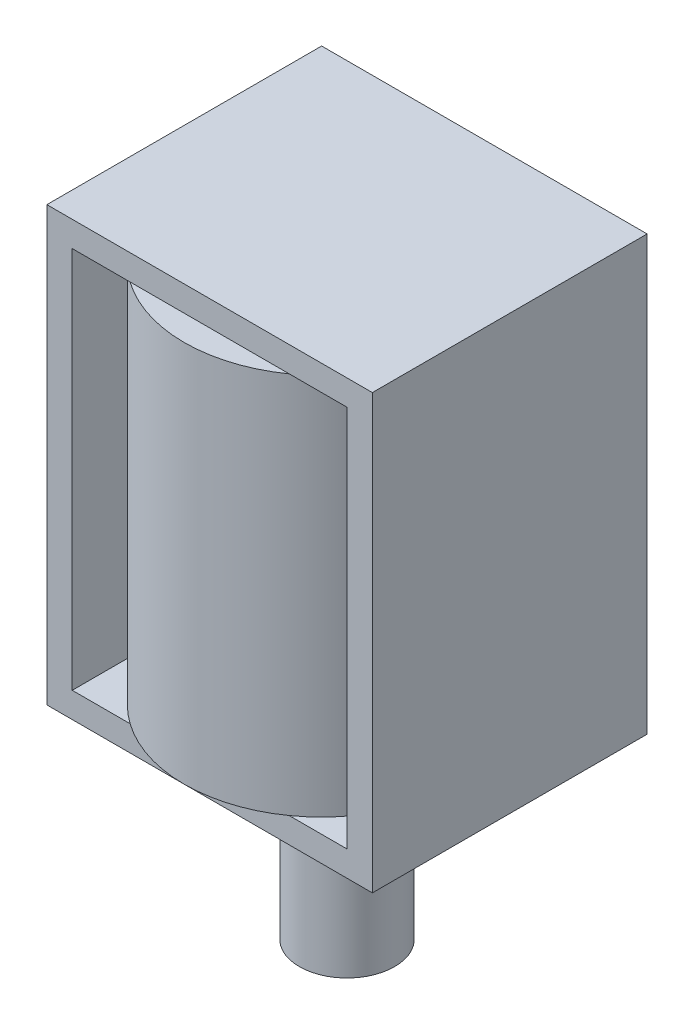
ISO-10303-21;
HEADER;
FILE_DESCRIPTION(('STEP AP214'),'2;1');
FILE_NAME('part.step','',(''),(''),'','','');
FILE_SCHEMA(('AUTOMOTIVE_DESIGN { 1 0 10303 214 1 1 1 1 }'));
ENDSEC;
DATA;
#1=APPLICATION_CONTEXT('core data for automotive mechanical design processes');
#2=APPLICATION_PROTOCOL_DEFINITION('international standard','automotive_design',2000,#1);
#3=PRODUCT_CONTEXT('',#1,'mechanical');
#4=PRODUCT('Part','Part','',(#3));
#5=PRODUCT_RELATED_PRODUCT_CATEGORY('part','',(#4));
#6=PRODUCT_DEFINITION_FORMATION('','',#4);
#7=PRODUCT_DEFINITION_CONTEXT('part definition',#1,'design');
#8=PRODUCT_DEFINITION('design','',#6,#7);
#9=PRODUCT_DEFINITION_SHAPE('','',#8);
#10=(LENGTH_UNIT() NAMED_UNIT(*) SI_UNIT(.MILLI.,.METRE.));
#11=(NAMED_UNIT(*) PLANE_ANGLE_UNIT() SI_UNIT($,.RADIAN.));
#12=(NAMED_UNIT(*) SI_UNIT($,.STERADIAN.) SOLID_ANGLE_UNIT());
#13=UNCERTAINTY_MEASURE_WITH_UNIT(LENGTH_MEASURE(1.E-05),#10,'distance_accuracy_value','');
#14=(GEOMETRIC_REPRESENTATION_CONTEXT(3) GLOBAL_UNCERTAINTY_ASSIGNED_CONTEXT((#13)) GLOBAL_UNIT_ASSIGNED_CONTEXT((#10,
#11,#12)) REPRESENTATION_CONTEXT('',''));
#15=CARTESIAN_POINT('',(0.,0.,0.));
#16=DIRECTION('',(0.,0.,1.));
#17=DIRECTION('',(1.,0.,0.));
#18=AXIS2_PLACEMENT_3D('',#15,#16,#17);
#19=CARTESIAN_POINT('',(-6.5,1.2,6.5));
#20=DIRECTION('',(1.,0.,0.));
#21=DIRECTION('',(0.,0.,-1.));
#22=AXIS2_PLACEMENT_3D('',#19,#20,#21);
#23=PLANE('',#22);
#24=DIRECTION('',(0.,0.,-1.));
#25=VECTOR('',#24,1.);
#26=CARTESIAN_POINT('',(-6.5,1.2,6.5));
#27=LINE('',#26,#25);
#28=CARTESIAN_POINT('',(-6.5,1.2,6.5));
#29=VERTEX_POINT('',#28);
#30=CARTESIAN_POINT('',(-6.5,1.2,1.2));
#31=VERTEX_POINT('',#30);
#32=EDGE_CURVE('E163',#29,#31,#27,.T.);
#33=ORIENTED_EDGE('',*,*,#32,.T.);
#34=DIRECTION('',(0.,-1.,0.));
#35=VECTOR('',#34,1.);
#36=CARTESIAN_POINT('',(-6.5,38.5520128817742,1.2));
#37=LINE('',#36,#35);
#38=CARTESIAN_POINT('',(-6.5,19.3,1.2));
#39=VERTEX_POINT('',#38);
#40=EDGE_CURVE('E157',#39,#31,#37,.T.);
#41=ORIENTED_EDGE('',*,*,#40,.F.);
#42=DIRECTION('',(0.,0.,-1.));
#43=VECTOR('',#42,1.);
#44=CARTESIAN_POINT('',(-6.5,19.3,6.5));
#45=LINE('',#44,#43);
#46=CARTESIAN_POINT('',(-6.5,19.3,6.5));
#47=VERTEX_POINT('',#46);
#48=EDGE_CURVE('E229',#47,#39,#45,.T.);
#49=ORIENTED_EDGE('',*,*,#48,.F.);
#50=DIRECTION('',(0.,-1.,0.));
#51=VECTOR('',#50,1.);
#52=CARTESIAN_POINT('',(-6.5,1.2,6.5));
#53=LINE('',#52,#51);
#54=EDGE_CURVE('E223',#47,#29,#53,.T.);
#55=ORIENTED_EDGE('',*,*,#54,.T.);
#56=EDGE_LOOP('',(#33,#41,#49,#55));
#57=FACE_BOUND('',#56,.T.);
#58=ADVANCED_FACE('F33',(#57),#23,.T.);
#59=CARTESIAN_POINT('',(-6.5,1.2,6.5));
#60=DIRECTION('',(0.,1.,0.));
#61=DIRECTION('',(0.,0.,1.));
#62=AXIS2_PLACEMENT_3D('',#59,#60,#61);
#63=PLANE('',#62);
#64=DIRECTION('',(1.,0.,0.));
#65=VECTOR('',#64,1.);
#66=CARTESIAN_POINT('',(-6.5,1.2,6.5));
#67=LINE('',#66,#65);
#68=CARTESIAN_POINT('',(-3.76297754444536,1.2,6.5));
#69=VERTEX_POINT('',#68);
#70=EDGE_CURVE('E255',#29,#69,#67,.T.);
#71=ORIENTED_EDGE('',*,*,#70,.T.);
#72=CARTESIAN_POINT('',(0.,1.2,1.2));
#73=DIRECTION('',(0.,1.,0.));
#74=DIRECTION('',(0.,0.,1.));
#75=AXIS2_PLACEMENT_3D('',#72,#73,#74);
#76=CIRCLE('',#75,6.5);
#77=EDGE_CURVE('E240',#31,#69,#76,.T.);
#78=ORIENTED_EDGE('',*,*,#77,.F.);
#79=ORIENTED_EDGE('',*,*,#32,.F.);
#80=EDGE_LOOP('',(#71,#78,#79));
#81=FACE_BOUND('',#80,.T.);
#82=ADVANCED_FACE('F297',(#81),#63,.T.);
#83=DIRECTION('',(0.,0.,-1.));
#84=VECTOR('',#83,1.);
#85=CARTESIAN_POINT('',(6.5,1.2,6.5));
#86=LINE('',#85,#84);
#87=CARTESIAN_POINT('',(6.5,1.2,6.5));
#88=VERTEX_POINT('',#87);
#89=CARTESIAN_POINT('',(6.5,1.2,1.2));
#90=VERTEX_POINT('',#89);
#91=EDGE_CURVE('E164',#88,#90,#86,.T.);
#92=ORIENTED_EDGE('',*,*,#91,.T.);
#93=CARTESIAN_POINT('',(3.76297754444536,1.2,6.5));
#94=VERTEX_POINT('',#93);
#95=EDGE_CURVE('E246',#94,#90,#76,.T.);
#96=ORIENTED_EDGE('',*,*,#95,.F.);
#97=EDGE_CURVE('E224',#94,#88,#67,.T.);
#98=ORIENTED_EDGE('',*,*,#97,.T.);
#99=EDGE_LOOP('',(#92,#96,#98));
#100=FACE_BOUND('',#99,.T.);
#101=ADVANCED_FACE('F303',(#100),#63,.T.);
#102=CARTESIAN_POINT('',(-6.5,1.2,0.));
#103=VERTEX_POINT('',#102);
#104=CARTESIAN_POINT('',(-6.5,1.2,-6.5));
#105=VERTEX_POINT('',#104);
#106=EDGE_CURVE('E154',#103,#105,#27,.T.);
#107=ORIENTED_EDGE('',*,*,#106,.F.);
#108=CARTESIAN_POINT('',(0.,1.2,0.));
#109=DIRECTION('',(0.,1.,0.));
#110=DIRECTION('',(0.,0.,1.));
#111=AXIS2_PLACEMENT_3D('',#108,#109,#110);
#112=CIRCLE('',#111,6.5);
#113=CARTESIAN_POINT('',(0.,1.2,-6.5));
#114=VERTEX_POINT('',#113);
#115=EDGE_CURVE('E139',#114,#103,#112,.T.);
#116=ORIENTED_EDGE('',*,*,#115,.F.);
#117=DIRECTION('',(1.,0.,0.));
#118=VECTOR('',#117,1.);
#119=CARTESIAN_POINT('',(-6.5,1.2,-6.5));
#120=LINE('',#119,#118);
#121=EDGE_CURVE('E161',#105,#114,#120,.T.);
#122=ORIENTED_EDGE('',*,*,#121,.F.);
#123=EDGE_LOOP('',(#107,#116,#122));
#124=FACE_BOUND('',#123,.T.);
#125=ADVANCED_FACE('F159',(#124),#63,.T.);
#126=CARTESIAN_POINT('',(6.5,1.2,6.5));
#127=DIRECTION('',(-1.,0.,0.));
#128=DIRECTION('',(0.,-1.,0.));
#129=AXIS2_PLACEMENT_3D('',#126,#127,#128);
#130=PLANE('',#129);
#131=CARTESIAN_POINT('',(6.5,1.2,0.));
#132=VERTEX_POINT('',#131);
#133=CARTESIAN_POINT('',(6.5,1.2,-6.5));
#134=VERTEX_POINT('',#133);
#135=EDGE_CURVE('E169',#132,#134,#86,.T.);
#136=ORIENTED_EDGE('',*,*,#135,.F.);
#137=DIRECTION('',(0.,-1.,0.));
#138=VECTOR('',#137,1.);
#139=CARTESIAN_POINT('',(6.5,38.5520128817742,0.));
#140=LINE('',#139,#138);
#141=CARTESIAN_POINT('',(6.5,19.3,0.));
#142=VERTEX_POINT('',#141);
#143=EDGE_CURVE('E239',#142,#132,#140,.T.);
#144=ORIENTED_EDGE('',*,*,#143,.F.);
#145=DIRECTION('',(0.,0.,-1.));
#146=VECTOR('',#145,1.);
#147=CARTESIAN_POINT('',(6.5,19.3,6.5));
#148=LINE('',#147,#146);
#149=CARTESIAN_POINT('',(6.5,19.3,-6.5));
#150=VERTEX_POINT('',#149);
#151=EDGE_CURVE('E212',#142,#150,#148,.T.);
#152=ORIENTED_EDGE('',*,*,#151,.T.);
#153=DIRECTION('',(0.,1.,0.));
#154=VECTOR('',#153,1.);
#155=CARTESIAN_POINT('',(6.5,1.2,-6.5));
#156=LINE('',#155,#154);
#157=EDGE_CURVE('E219',#134,#150,#156,.T.);
#158=ORIENTED_EDGE('',*,*,#157,.F.);
#159=EDGE_LOOP('',(#136,#144,#152,#158));
#160=FACE_BOUND('',#159,.T.);
#161=ADVANCED_FACE('F238',(#160),#130,.T.);
#162=CARTESIAN_POINT('',(-6.5,19.3,6.5));
#163=DIRECTION('',(0.,-1.,0.));
#164=DIRECTION('',(0.,0.,-1.));
#165=AXIS2_PLACEMENT_3D('',#162,#163,#164);
#166=PLANE('',#165);
#167=ORIENTED_EDGE('',*,*,#48,.T.);
#168=CARTESIAN_POINT('',(0.,19.3,1.2));
#169=DIRECTION('',(0.,-1.,0.));
#170=DIRECTION('',(0.,0.,-1.));
#171=AXIS2_PLACEMENT_3D('',#168,#169,#170);
#172=CIRCLE('',#171,6.5);
#173=CARTESIAN_POINT('',(-3.76297754444536,19.3,6.5));
#174=VERTEX_POINT('',#173);
#175=EDGE_CURVE('E11',#39,#174,#172,.F.);
#176=ORIENTED_EDGE('',*,*,#175,.T.);
#177=DIRECTION('',(-1.,0.,0.));
#178=VECTOR('',#177,1.);
#179=CARTESIAN_POINT('',(-6.5,19.3,6.5));
#180=LINE('',#179,#178);
#181=EDGE_CURVE('E260',#174,#47,#180,.T.);
#182=ORIENTED_EDGE('',*,*,#181,.T.);
#183=EDGE_LOOP('',(#167,#176,#182));
#184=FACE_BOUND('',#183,.T.);
#185=ADVANCED_FACE('F278',(#184),#166,.T.);
#186=CARTESIAN_POINT('',(6.5,19.3,6.5));
#187=VERTEX_POINT('',#186);
#188=CARTESIAN_POINT('',(3.76297754444536,19.3,6.5));
#189=VERTEX_POINT('',#188);
#190=EDGE_CURVE('E261',#187,#189,#180,.T.);
#191=ORIENTED_EDGE('',*,*,#190,.T.);
#192=CARTESIAN_POINT('',(0.,19.3,1.2));
#193=DIRECTION('',(0.,-1.,0.));
#194=DIRECTION('',(0.,0.,-1.));
#195=AXIS2_PLACEMENT_3D('',#192,#193,#194);
#196=CIRCLE('',#195,6.5);
#197=CARTESIAN_POINT('',(6.5,19.3,1.2));
#198=VERTEX_POINT('',#197);
#199=EDGE_CURVE('E270',#198,#189,#196,.T.);
#200=ORIENTED_EDGE('',*,*,#199,.F.);
#201=EDGE_CURVE('E231',#187,#198,#148,.T.);
#202=ORIENTED_EDGE('',*,*,#201,.F.);
#203=EDGE_LOOP('',(#191,#200,#202));
#204=FACE_BOUND('',#203,.T.);
#205=ADVANCED_FACE('F349',(#204),#166,.T.);
#206=DIRECTION('',(-1.,0.,0.));
#207=VECTOR('',#206,1.);
#208=CARTESIAN_POINT('',(-6.5,19.3,-6.5));
#209=LINE('',#208,#207);
#210=CARTESIAN_POINT('',(0.,19.3,-6.5));
#211=VERTEX_POINT('',#210);
#212=CARTESIAN_POINT('',(-6.5,19.3,-6.5));
#213=VERTEX_POINT('',#212);
#214=EDGE_CURVE('E216',#211,#213,#209,.T.);
#215=ORIENTED_EDGE('',*,*,#214,.F.);
#216=CARTESIAN_POINT('',(0.,19.3,0.));
#217=DIRECTION('',(0.,-1.,0.));
#218=DIRECTION('',(0.,0.,-1.));
#219=AXIS2_PLACEMENT_3D('',#216,#217,#218);
#220=CIRCLE('',#219,6.5);
#221=CARTESIAN_POINT('',(-6.5,19.3,0.));
#222=VERTEX_POINT('',#221);
#223=EDGE_CURVE('E56',#222,#211,#220,.T.);
#224=ORIENTED_EDGE('',*,*,#223,.F.);
#225=EDGE_CURVE('E155',#222,#213,#45,.T.);
#226=ORIENTED_EDGE('',*,*,#225,.T.);
#227=EDGE_LOOP('',(#215,#224,#226));
#228=FACE_BOUND('',#227,.T.);
#229=ADVANCED_FACE('F217',(#228),#166,.T.);
#230=CARTESIAN_POINT('',(0.,0.,6.5));
#231=DIRECTION('',(0.,0.,-1.));
#232=DIRECTION('',(-1.,0.,0.));
#233=AXIS2_PLACEMENT_3D('',#230,#231,#232);
#234=PLANE('',#233);
#235=DIRECTION('',(0.,-1.,0.));
#236=VECTOR('',#235,1.);
#237=CARTESIAN_POINT('',(-7.7,0.,6.5));
#238=LINE('',#237,#236);
#239=CARTESIAN_POINT('',(-7.7,20.5,6.5));
#240=VERTEX_POINT('',#239);
#241=CARTESIAN_POINT('',(-7.7,0.,6.5));
#242=VERTEX_POINT('',#241);
#243=EDGE_CURVE('E173',#240,#242,#238,.T.);
#244=ORIENTED_EDGE('',*,*,#243,.T.);
#245=DIRECTION('',(1.,0.,0.));
#246=VECTOR('',#245,1.);
#247=CARTESIAN_POINT('',(-7.7,0.,6.5));
#248=LINE('',#247,#246);
#249=CARTESIAN_POINT('',(7.7,0.,6.5));
#250=VERTEX_POINT('',#249);
#251=EDGE_CURVE('E176',#242,#250,#248,.T.);
#252=ORIENTED_EDGE('',*,*,#251,.T.);
#253=DIRECTION('',(0.,1.,0.));
#254=VECTOR('',#253,1.);
#255=CARTESIAN_POINT('',(7.7,0.,6.5));
#256=LINE('',#255,#254);
#257=CARTESIAN_POINT('',(7.7,20.5,6.5));
#258=VERTEX_POINT('',#257);
#259=EDGE_CURVE('E179',#250,#258,#256,.T.);
#260=ORIENTED_EDGE('',*,*,#259,.T.);
#261=DIRECTION('',(-1.,0.,0.));
#262=VECTOR('',#261,1.);
#263=CARTESIAN_POINT('',(-7.7,20.5,6.5));
#264=LINE('',#263,#262);
#265=EDGE_CURVE('E181',#258,#240,#264,.T.);
#266=ORIENTED_EDGE('',*,*,#265,.T.);
#267=EDGE_LOOP('',(#244,#252,#260,#266));
#268=FACE_BOUND('',#267,.T.);
#269=ORIENTED_EDGE('',*,*,#54,.F.);
#270=ORIENTED_EDGE('',*,*,#181,.F.);
#271=EDGE_CURVE('E264',#189,#174,#180,.T.);
#272=ORIENTED_EDGE('',*,*,#271,.F.);
#273=ORIENTED_EDGE('',*,*,#190,.F.);
#274=DIRECTION('',(0.,1.,0.));
#275=VECTOR('',#274,1.);
#276=CARTESIAN_POINT('',(6.5,1.2,6.5));
#277=LINE('',#276,#275);
#278=EDGE_CURVE('E258',#88,#187,#277,.T.);
#279=ORIENTED_EDGE('',*,*,#278,.F.);
#280=ORIENTED_EDGE('',*,*,#97,.F.);
#281=DIRECTION('',(1.,0.,0.));
#282=VECTOR('',#281,1.);
#283=CARTESIAN_POINT('',(0.,1.2,6.5));
#284=LINE('',#283,#282);
#285=EDGE_CURVE('E249',#69,#94,#284,.T.);
#286=ORIENTED_EDGE('',*,*,#285,.F.);
#287=ORIENTED_EDGE('',*,*,#70,.F.);
#288=EDGE_LOOP('',(#269,#270,#272,#273,#279,#280,#286,#287));
#289=FACE_BOUND('',#288,.T.);
#290=ADVANCED_FACE('F282',(#268,#289),#234,.F.);
#291=CARTESIAN_POINT('',(0.,0.,-6.5));
#292=DIRECTION('',(0.,0.,-1.));
#293=DIRECTION('',(-1.,0.,0.));
#294=AXIS2_PLACEMENT_3D('',#291,#292,#293);
#295=PLANE('',#294);
#296=DIRECTION('',(0.,-1.,0.));
#297=VECTOR('',#296,1.);
#298=CARTESIAN_POINT('',(-7.7,0.,-6.5));
#299=LINE('',#298,#297);
#300=CARTESIAN_POINT('',(-7.7,20.5,-6.5));
#301=VERTEX_POINT('',#300);
#302=CARTESIAN_POINT('',(-7.7,0.,-6.5));
#303=VERTEX_POINT('',#302);
#304=EDGE_CURVE('E167',#301,#303,#299,.T.);
#305=ORIENTED_EDGE('',*,*,#304,.F.);
#306=DIRECTION('',(-1.,0.,0.));
#307=VECTOR('',#306,1.);
#308=CARTESIAN_POINT('',(-7.7,20.5,-6.5));
#309=LINE('',#308,#307);
#310=CARTESIAN_POINT('',(7.7,20.5,-6.5));
#311=VERTEX_POINT('',#310);
#312=EDGE_CURVE('E177',#311,#301,#309,.T.);
#313=ORIENTED_EDGE('',*,*,#312,.F.);
#314=DIRECTION('',(0.,1.,0.));
#315=VECTOR('',#314,1.);
#316=CARTESIAN_POINT('',(7.7,0.,-6.5));
#317=LINE('',#316,#315);
#318=CARTESIAN_POINT('',(7.7,0.,-6.5));
#319=VERTEX_POINT('',#318);
#320=EDGE_CURVE('E188',#319,#311,#317,.T.);
#321=ORIENTED_EDGE('',*,*,#320,.F.);
#322=DIRECTION('',(1.,0.,0.));
#323=VECTOR('',#322,1.);
#324=CARTESIAN_POINT('',(-7.7,0.,-6.5));
#325=LINE('',#324,#323);
#326=EDGE_CURVE('E186',#303,#319,#325,.T.);
#327=ORIENTED_EDGE('',*,*,#326,.F.);
#328=EDGE_LOOP('',(#305,#313,#321,#327));
#329=FACE_BOUND('',#328,.T.);
#330=EDGE_CURVE('E210',#150,#211,#209,.T.);
#331=ORIENTED_EDGE('',*,*,#330,.T.);
#332=ORIENTED_EDGE('',*,*,#214,.T.);
#333=DIRECTION('',(0.,-1.,0.));
#334=VECTOR('',#333,1.);
#335=CARTESIAN_POINT('',(-6.5,1.2,-6.5));
#336=LINE('',#335,#334);
#337=EDGE_CURVE('E253',#213,#105,#336,.T.);
#338=ORIENTED_EDGE('',*,*,#337,.T.);
#339=ORIENTED_EDGE('',*,*,#121,.T.);
#340=EDGE_CURVE('E265',#114,#134,#120,.T.);
#341=ORIENTED_EDGE('',*,*,#340,.T.);
#342=ORIENTED_EDGE('',*,*,#157,.T.);
#343=EDGE_LOOP('',(#331,#332,#338,#339,#341,#342));
#344=FACE_BOUND('',#343,.T.);
#345=ADVANCED_FACE('F221',(#329,#344),#295,.T.);
#346=CARTESIAN_POINT('',(-7.7,0.,6.5));
#347=DIRECTION('',(1.,0.,0.));
#348=DIRECTION('',(0.,0.,-1.));
#349=AXIS2_PLACEMENT_3D('',#346,#347,#348);
#350=PLANE('',#349);
#351=ORIENTED_EDGE('',*,*,#304,.T.);
#352=DIRECTION('',(0.,0.,-1.));
#353=VECTOR('',#352,1.);
#354=CARTESIAN_POINT('',(-7.7,0.,6.5));
#355=LINE('',#354,#353);
#356=EDGE_CURVE('E199',#242,#303,#355,.T.);
#357=ORIENTED_EDGE('',*,*,#356,.F.);
#358=ORIENTED_EDGE('',*,*,#243,.F.);
#359=DIRECTION('',(0.,0.,-1.));
#360=VECTOR('',#359,1.);
#361=CARTESIAN_POINT('',(-7.7,20.5,6.5));
#362=LINE('',#361,#360);
#363=EDGE_CURVE('E183',#240,#301,#362,.T.);
#364=ORIENTED_EDGE('',*,*,#363,.T.);
#365=EDGE_LOOP('',(#351,#357,#358,#364));
#366=FACE_BOUND('',#365,.T.);
#367=ADVANCED_FACE('F35',(#366),#350,.F.);
#368=CARTESIAN_POINT('',(-7.7,0.,6.5));
#369=DIRECTION('',(0.,1.,0.));
#370=DIRECTION('',(0.,0.,1.));
#371=AXIS2_PLACEMENT_3D('',#368,#369,#370);
#372=PLANE('',#371);
#373=CARTESIAN_POINT('',(0.,0.,0.));
#374=DIRECTION('',(0.,1.,0.));
#375=DIRECTION('',(0.,0.,1.));
#376=AXIS2_PLACEMENT_3D('',#373,#374,#375);
#377=CIRCLE('',#376,2.25);
#378=CARTESIAN_POINT('',(0.,0.,2.25));
#379=VERTEX_POINT('',#378);
#380=EDGE_CURVE('E202',#379,#379,#377,.F.);
#381=ORIENTED_EDGE('',*,*,#380,.F.);
#382=EDGE_LOOP('',(#381));
#383=FACE_BOUND('',#382,.T.);
#384=ORIENTED_EDGE('',*,*,#326,.T.);
#385=DIRECTION('',(0.,0.,-1.));
#386=VECTOR('',#385,1.);
#387=CARTESIAN_POINT('',(7.7,0.,6.5));
#388=LINE('',#387,#386);
#389=EDGE_CURVE('E196',#250,#319,#388,.T.);
#390=ORIENTED_EDGE('',*,*,#389,.F.);
#391=ORIENTED_EDGE('',*,*,#251,.F.);
#392=ORIENTED_EDGE('',*,*,#356,.T.);
#393=EDGE_LOOP('',(#384,#390,#391,#392));
#394=FACE_BOUND('',#393,.T.);
#395=ADVANCED_FACE('F320',(#383,#394),#372,.F.);
#396=CARTESIAN_POINT('',(7.7,0.,6.5));
#397=DIRECTION('',(-1.,0.,0.));
#398=DIRECTION('',(0.,0.,1.));
#399=AXIS2_PLACEMENT_3D('',#396,#397,#398);
#400=PLANE('',#399);
#401=ORIENTED_EDGE('',*,*,#320,.T.);
#402=DIRECTION('',(0.,0.,-1.));
#403=VECTOR('',#402,1.);
#404=CARTESIAN_POINT('',(7.7,20.5,6.5));
#405=LINE('',#404,#403);
#406=EDGE_CURVE('E193',#258,#311,#405,.T.);
#407=ORIENTED_EDGE('',*,*,#406,.F.);
#408=ORIENTED_EDGE('',*,*,#259,.F.);
#409=ORIENTED_EDGE('',*,*,#389,.T.);
#410=EDGE_LOOP('',(#401,#407,#408,#409));
#411=FACE_BOUND('',#410,.T.);
#412=ADVANCED_FACE('F314',(#411),#400,.F.);
#413=CARTESIAN_POINT('',(-7.7,20.5,6.5));
#414=DIRECTION('',(0.,-1.,0.));
#415=DIRECTION('',(0.,0.,-1.));
#416=AXIS2_PLACEMENT_3D('',#413,#414,#415);
#417=PLANE('',#416);
#418=ORIENTED_EDGE('',*,*,#312,.T.);
#419=ORIENTED_EDGE('',*,*,#363,.F.);
#420=ORIENTED_EDGE('',*,*,#265,.F.);
#421=ORIENTED_EDGE('',*,*,#406,.T.);
#422=EDGE_LOOP('',(#418,#419,#420,#421));
#423=FACE_BOUND('',#422,.T.);
#424=ADVANCED_FACE('F308',(#423),#417,.F.);
#425=DIRECTION('',(0.,-1.,0.));
#426=VECTOR('',#425,1.);
#427=CARTESIAN_POINT('',(-6.5,38.5520128817742,0.));
#428=LINE('',#427,#426);
#429=EDGE_CURVE('E142',#222,#103,#428,.T.);
#430=ORIENTED_EDGE('',*,*,#429,.T.);
#431=ORIENTED_EDGE('',*,*,#106,.T.);
#432=ORIENTED_EDGE('',*,*,#337,.F.);
#433=ORIENTED_EDGE('',*,*,#225,.F.);
#434=EDGE_LOOP('',(#430,#431,#432,#433));
#435=FACE_BOUND('',#434,.T.);
#436=ADVANCED_FACE('F152',(#435),#23,.T.);
#437=ORIENTED_EDGE('',*,*,#340,.F.);
#438=EDGE_CURVE('E144',#132,#114,#112,.T.);
#439=ORIENTED_EDGE('',*,*,#438,.F.);
#440=ORIENTED_EDGE('',*,*,#135,.T.);
#441=EDGE_LOOP('',(#437,#439,#440));
#442=FACE_BOUND('',#441,.T.);
#443=ADVANCED_FACE('F267',(#442),#63,.T.);
#444=DIRECTION('',(0.,-1.,0.));
#445=VECTOR('',#444,1.);
#446=CARTESIAN_POINT('',(6.5,38.5520128817742,1.2));
#447=LINE('',#446,#445);
#448=EDGE_CURVE('E48',#198,#90,#447,.T.);
#449=ORIENTED_EDGE('',*,*,#448,.T.);
#450=ORIENTED_EDGE('',*,*,#91,.F.);
#451=ORIENTED_EDGE('',*,*,#278,.T.);
#452=ORIENTED_EDGE('',*,*,#201,.T.);
#453=EDGE_LOOP('',(#449,#450,#451,#452));
#454=FACE_BOUND('',#453,.T.);
#455=ADVANCED_FACE('F313',(#454),#130,.T.);
#456=ORIENTED_EDGE('',*,*,#151,.F.);
#457=CARTESIAN_POINT('',(0.,19.3,0.));
#458=DIRECTION('',(0.,-1.,0.));
#459=DIRECTION('',(0.,0.,-1.));
#460=AXIS2_PLACEMENT_3D('',#457,#458,#459);
#461=CIRCLE('',#460,6.5);
#462=EDGE_CURVE('E41',#142,#211,#461,.F.);
#463=ORIENTED_EDGE('',*,*,#462,.T.);
#464=ORIENTED_EDGE('',*,*,#330,.F.);
#465=EDGE_LOOP('',(#456,#463,#464));
#466=FACE_BOUND('',#465,.T.);
#467=ADVANCED_FACE('F208',(#466),#166,.T.);
#468=CARTESIAN_POINT('',(0.,-9.,0.));
#469=DIRECTION('',(0.,1.,0.));
#470=DIRECTION('',(0.,0.,1.));
#471=AXIS2_PLACEMENT_3D('',#468,#469,#470);
#472=CYLINDRICAL_SURFACE('',#471,2.25);
#473=CARTESIAN_POINT('',(0.,-9.,0.));
#474=DIRECTION('',(0.,-1.,0.));
#475=DIRECTION('',(0.,0.,-1.));
#476=AXIS2_PLACEMENT_3D('',#473,#474,#475);
#477=CIRCLE('',#476,2.25);
#478=CARTESIAN_POINT('',(0.,-9.,-2.25));
#479=VERTEX_POINT('',#478);
#480=EDGE_CURVE('E251',#479,#479,#477,.T.);
#481=ORIENTED_EDGE('',*,*,#480,.F.);
#482=EDGE_LOOP('',(#481));
#483=FACE_BOUND('',#482,.T.);
#484=ORIENTED_EDGE('',*,*,#380,.T.);
#485=EDGE_LOOP('',(#484));
#486=FACE_BOUND('',#485,.T.);
#487=ADVANCED_FACE('F358',(#483,#486),#472,.T.);
#488=CARTESIAN_POINT('',(0.,-9.,0.));
#489=DIRECTION('',(0.,-1.,0.));
#490=DIRECTION('',(0.,0.,-1.));
#491=AXIS2_PLACEMENT_3D('',#488,#489,#490);
#492=PLANE('',#491);
#493=ORIENTED_EDGE('',*,*,#480,.T.);
#494=EDGE_LOOP('',(#493));
#495=FACE_BOUND('',#494,.T.);
#496=ADVANCED_FACE('F363',(#495),#492,.T.);
#497=CARTESIAN_POINT('',(0.,38.5520128817742,0.));
#498=DIRECTION('',(0.,-1.,0.));
#499=DIRECTION('',(0.,0.,-1.));
#500=AXIS2_PLACEMENT_3D('',#497,#498,#499);
#501=CYLINDRICAL_SURFACE('',#500,6.5);
#502=ORIENTED_EDGE('',*,*,#429,.F.);
#503=ORIENTED_EDGE('',*,*,#223,.T.);
#504=ORIENTED_EDGE('',*,*,#462,.F.);
#505=ORIENTED_EDGE('',*,*,#143,.T.);
#506=ORIENTED_EDGE('',*,*,#438,.T.);
#507=ORIENTED_EDGE('',*,*,#115,.T.);
#508=EDGE_LOOP('',(#502,#503,#504,#505,#506,#507));
#509=FACE_BOUND('',#508,.T.);
#510=ADVANCED_FACE('F141',(#509),#501,.T.);
#511=CARTESIAN_POINT('',(0.,1.2,0.));
#512=DIRECTION('',(0.,1.,0.));
#513=DIRECTION('',(0.,0.,1.));
#514=AXIS2_PLACEMENT_3D('',#511,#512,#513);
#515=PLANE('',#514);
#516=EDGE_CURVE('E244',#69,#94,#76,.T.);
#517=ORIENTED_EDGE('',*,*,#516,.F.);
#518=ORIENTED_EDGE('',*,*,#285,.T.);
#519=EDGE_LOOP('',(#517,#518));
#520=FACE_BOUND('',#519,.T.);
#521=ADVANCED_FACE('F287',(#520),#515,.F.);
#522=CARTESIAN_POINT('',(-6.5,19.3,6.5));
#523=DIRECTION('',(0.,-1.,0.));
#524=DIRECTION('',(0.,0.,-1.));
#525=AXIS2_PLACEMENT_3D('',#522,#523,#524);
#526=PLANE('',#525);
#527=EDGE_CURVE('E156',#189,#174,#196,.T.);
#528=ORIENTED_EDGE('',*,*,#527,.F.);
#529=ORIENTED_EDGE('',*,*,#271,.T.);
#530=EDGE_LOOP('',(#528,#529));
#531=FACE_BOUND('',#530,.T.);
#532=ADVANCED_FACE('F285',(#531),#526,.F.);
#533=CARTESIAN_POINT('',(0.,38.5520128817742,1.2));
#534=DIRECTION('',(0.,-1.,0.));
#535=DIRECTION('',(0.,0.,-1.));
#536=AXIS2_PLACEMENT_3D('',#533,#534,#535);
#537=CYLINDRICAL_SURFACE('',#536,6.5);
#538=ORIENTED_EDGE('',*,*,#448,.F.);
#539=ORIENTED_EDGE('',*,*,#199,.T.);
#540=ORIENTED_EDGE('',*,*,#527,.T.);
#541=ORIENTED_EDGE('',*,*,#175,.F.);
#542=ORIENTED_EDGE('',*,*,#40,.T.);
#543=ORIENTED_EDGE('',*,*,#77,.T.);
#544=ORIENTED_EDGE('',*,*,#516,.T.);
#545=ORIENTED_EDGE('',*,*,#95,.T.);
#546=EDGE_LOOP('',(#538,#539,#540,#541,#542,#543,#544,#545));
#547=FACE_BOUND('',#546,.T.);
#548=ADVANCED_FACE('F273',(#547),#537,.T.);
#549=CLOSED_SHELL('',(#58,#82,#101,#125,#161,#185,#205,#229,#290,#345,#367,#395,#412,#424,#436,
#443,#455,#467,#487,#496,#510,#521,#532,#548));
#550=MANIFOLD_SOLID_BREP('B2',#549);
#551=ADVANCED_BREP_SHAPE_REPRESENTATION('',(#18,#550),#14);
#552=SHAPE_DEFINITION_REPRESENTATION(#9,#551);
ENDSEC;
END-ISO-10303-21;
